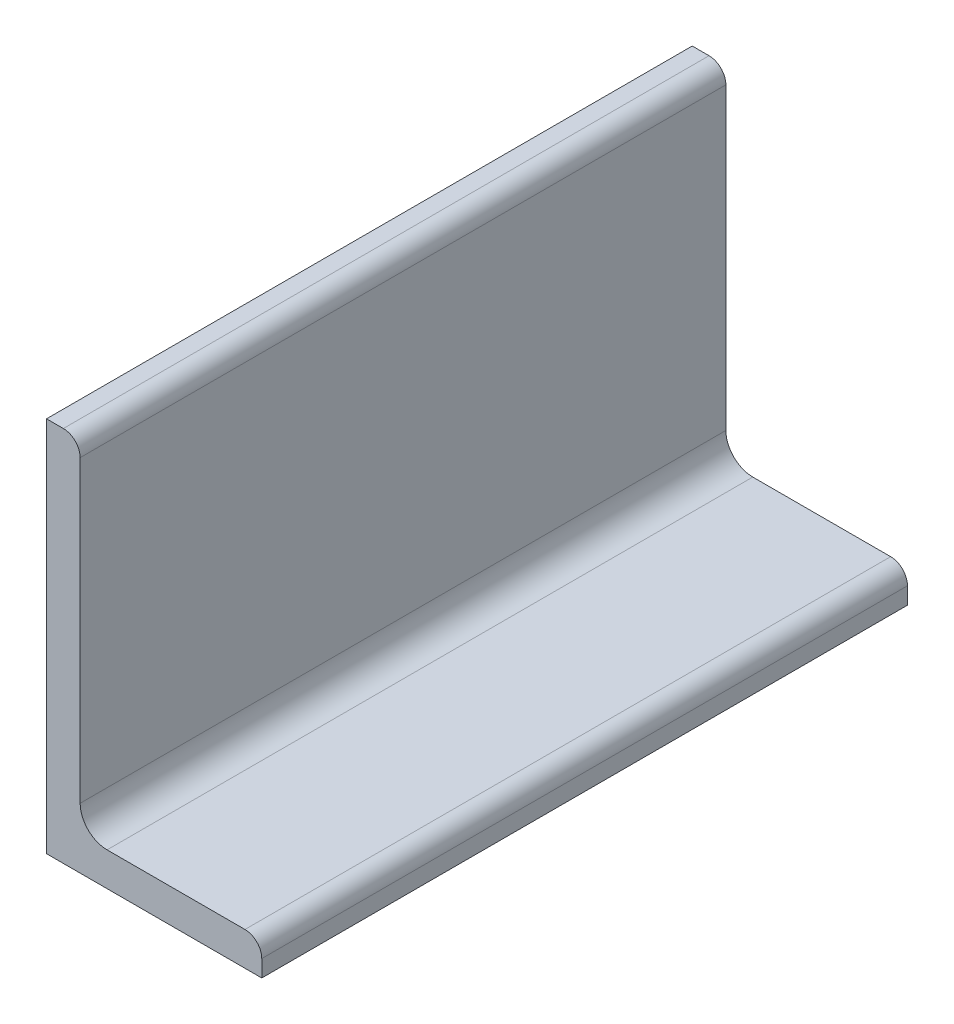
ISO-10303-21;
HEADER;
FILE_DESCRIPTION(('STEP AP214'),'2;1');
FILE_NAME('part.step','',(''),(''),'','','');
FILE_SCHEMA(('AUTOMOTIVE_DESIGN { 1 0 10303 214 1 1 1 1 }'));
ENDSEC;
DATA;
#1=APPLICATION_CONTEXT('core data for automotive mechanical design processes');
#2=APPLICATION_PROTOCOL_DEFINITION('international standard','automotive_design',2000,#1);
#3=PRODUCT_CONTEXT('',#1,'mechanical');
#4=PRODUCT('Part','Part','',(#3));
#5=PRODUCT_RELATED_PRODUCT_CATEGORY('part','',(#4));
#6=PRODUCT_DEFINITION_FORMATION('','',#4);
#7=PRODUCT_DEFINITION_CONTEXT('part definition',#1,'design');
#8=PRODUCT_DEFINITION('design','',#6,#7);
#9=PRODUCT_DEFINITION_SHAPE('','',#8);
#10=(LENGTH_UNIT() NAMED_UNIT(*) SI_UNIT(.MILLI.,.METRE.));
#11=(NAMED_UNIT(*) PLANE_ANGLE_UNIT() SI_UNIT($,.RADIAN.));
#12=(NAMED_UNIT(*) SI_UNIT($,.STERADIAN.) SOLID_ANGLE_UNIT());
#13=UNCERTAINTY_MEASURE_WITH_UNIT(LENGTH_MEASURE(1.E-05),#10,'distance_accuracy_value','');
#14=(GEOMETRIC_REPRESENTATION_CONTEXT(3) GLOBAL_UNCERTAINTY_ASSIGNED_CONTEXT((#13)) GLOBAL_UNIT_ASSIGNED_CONTEXT((#10,
#11,#12)) REPRESENTATION_CONTEXT('',''));
#15=CARTESIAN_POINT('',(0.,0.,0.));
#16=DIRECTION('',(0.,0.,1.));
#17=DIRECTION('',(1.,0.,0.));
#18=AXIS2_PLACEMENT_3D('',#15,#16,#17);
#19=CARTESIAN_POINT('',(0.865045893659089,178.809200992538,304.8));
#20=DIRECTION('',(1.,0.,0.));
#21=DIRECTION('',(0.,0.,-1.));
#22=AXIS2_PLACEMENT_3D('',#19,#20,#21);
#23=PLANE('',#22);
#24=DIRECTION('',(0.,-1.,0.));
#25=VECTOR('',#24,1.);
#26=CARTESIAN_POINT('',(0.865045893659089,178.809200992538,0.));
#27=LINE('',#26,#25);
#28=CARTESIAN_POINT('',(0.865045893659089,178.809200992538,0.));
#29=VERTEX_POINT('',#28);
#30=CARTESIAN_POINT('',(0.865045893659089,1.00920099253831,0.));
#31=VERTEX_POINT('',#30);
#32=EDGE_CURVE('E135',#29,#31,#27,.T.);
#33=ORIENTED_EDGE('',*,*,#32,.T.);
#34=DIRECTION('',(0.,0.,-1.));
#35=VECTOR('',#34,1.);
#36=CARTESIAN_POINT('',(0.865045893659089,1.00920099253831,304.8));
#37=LINE('',#36,#35);
#38=CARTESIAN_POINT('',(0.865045893659089,1.00920099253831,304.8));
#39=VERTEX_POINT('',#38);
#40=EDGE_CURVE('E11',#39,#31,#37,.T.);
#41=ORIENTED_EDGE('',*,*,#40,.F.);
#42=DIRECTION('',(0.,-1.,0.));
#43=VECTOR('',#42,1.);
#44=CARTESIAN_POINT('',(0.865045893659089,178.809200992538,304.8));
#45=LINE('',#44,#43);
#46=CARTESIAN_POINT('',(0.865045893659089,178.809200992538,304.8));
#47=VERTEX_POINT('',#46);
#48=EDGE_CURVE('E151',#47,#39,#45,.T.);
#49=ORIENTED_EDGE('',*,*,#48,.F.);
#50=DIRECTION('',(0.,0.,-1.));
#51=VECTOR('',#50,1.);
#52=CARTESIAN_POINT('',(0.865045893659089,178.809200992538,304.8));
#53=LINE('',#52,#51);
#54=EDGE_CURVE('E131',#47,#29,#53,.T.);
#55=ORIENTED_EDGE('',*,*,#54,.T.);
#56=EDGE_LOOP('',(#33,#41,#49,#55));
#57=FACE_BOUND('',#56,.T.);
#58=ADVANCED_FACE('F33',(#57),#23,.F.);
#59=CARTESIAN_POINT('',(0.865045893659089,1.00920099253831,304.8));
#60=DIRECTION('',(0.,1.,0.));
#61=DIRECTION('',(0.,0.,1.));
#62=AXIS2_PLACEMENT_3D('',#59,#60,#61);
#63=PLANE('',#62);
#64=DIRECTION('',(1.,0.,0.));
#65=VECTOR('',#64,1.);
#66=CARTESIAN_POINT('',(0.865045893659089,1.00920099253831,0.));
#67=LINE('',#66,#65);
#68=CARTESIAN_POINT('',(102.465045893659,1.00920099253831,0.));
#69=VERTEX_POINT('',#68);
#70=EDGE_CURVE('E138',#31,#69,#67,.T.);
#71=ORIENTED_EDGE('',*,*,#70,.T.);
#72=DIRECTION('',(0.,0.,-1.));
#73=VECTOR('',#72,1.);
#74=CARTESIAN_POINT('',(102.465045893659,1.00920099253831,304.8));
#75=LINE('',#74,#73);
#76=CARTESIAN_POINT('',(102.465045893659,1.00920099253831,304.8));
#77=VERTEX_POINT('',#76);
#78=EDGE_CURVE('E41',#77,#69,#75,.T.);
#79=ORIENTED_EDGE('',*,*,#78,.F.);
#80=DIRECTION('',(1.,0.,0.));
#81=VECTOR('',#80,1.);
#82=CARTESIAN_POINT('',(0.865045893659089,1.00920099253831,304.8));
#83=LINE('',#82,#81);
#84=EDGE_CURVE('E95',#39,#77,#83,.T.);
#85=ORIENTED_EDGE('',*,*,#84,.F.);
#86=ORIENTED_EDGE('',*,*,#40,.T.);
#87=EDGE_LOOP('',(#71,#79,#85,#86));
#88=FACE_BOUND('',#87,.T.);
#89=ADVANCED_FACE('F194',(#88),#63,.F.);
#90=CARTESIAN_POINT('',(102.465045893659,1.00920099253831,304.8));
#91=DIRECTION('',(-1.,0.,0.));
#92=DIRECTION('',(0.,0.,1.));
#93=AXIS2_PLACEMENT_3D('',#90,#91,#92);
#94=PLANE('',#93);
#95=DIRECTION('',(0.,1.,0.));
#96=VECTOR('',#95,1.);
#97=CARTESIAN_POINT('',(102.465045893659,1.00920099253831,0.));
#98=LINE('',#97,#96);
#99=CARTESIAN_POINT('',(102.465045893659,8.94670099253831,0.));
#100=VERTEX_POINT('',#99);
#101=EDGE_CURVE('E140',#69,#100,#98,.T.);
#102=ORIENTED_EDGE('',*,*,#101,.T.);
#103=DIRECTION('',(0.,0.,-1.));
#104=VECTOR('',#103,1.);
#105=CARTESIAN_POINT('',(102.465045893659,8.94670099253831,304.8));
#106=LINE('',#105,#104);
#107=CARTESIAN_POINT('',(102.465045893659,8.94670099253831,304.8));
#108=VERTEX_POINT('',#107);
#109=EDGE_CURVE('E161',#108,#100,#106,.T.);
#110=ORIENTED_EDGE('',*,*,#109,.F.);
#111=DIRECTION('',(0.,1.,0.));
#112=VECTOR('',#111,1.);
#113=CARTESIAN_POINT('',(102.465045893659,1.00920099253831,304.8));
#114=LINE('',#113,#112);
#115=EDGE_CURVE('E169',#77,#108,#114,.T.);
#116=ORIENTED_EDGE('',*,*,#115,.F.);
#117=ORIENTED_EDGE('',*,*,#78,.T.);
#118=EDGE_LOOP('',(#102,#110,#116,#117));
#119=FACE_BOUND('',#118,.T.);
#120=ADVANCED_FACE('F167',(#119),#94,.F.);
#121=CARTESIAN_POINT('',(94.5275458936591,8.94670099253831,304.8));
#122=DIRECTION('',(0.,0.,-1.));
#123=DIRECTION('',(-1.,0.,0.));
#124=AXIS2_PLACEMENT_3D('',#121,#122,#123);
#125=CYLINDRICAL_SURFACE('',#124,7.93750000000001);
#126=CARTESIAN_POINT('',(94.5275458936591,8.94670099253831,0.));
#127=DIRECTION('',(0.,0.,1.));
#128=DIRECTION('',(1.,0.,0.));
#129=AXIS2_PLACEMENT_3D('',#126,#127,#128);
#130=CIRCLE('',#129,7.93750000000001);
#131=CARTESIAN_POINT('',(94.5275458936591,16.8842009925383,0.));
#132=VERTEX_POINT('',#131);
#133=EDGE_CURVE('E142',#100,#132,#130,.T.);
#134=ORIENTED_EDGE('',*,*,#133,.T.);
#135=DIRECTION('',(0.,0.,-1.));
#136=VECTOR('',#135,1.);
#137=CARTESIAN_POINT('',(94.5275458936591,16.8842009925383,304.8));
#138=LINE('',#137,#136);
#139=CARTESIAN_POINT('',(94.5275458936591,16.8842009925383,304.8));
#140=VERTEX_POINT('',#139);
#141=EDGE_CURVE('E158',#140,#132,#138,.T.);
#142=ORIENTED_EDGE('',*,*,#141,.F.);
#143=CARTESIAN_POINT('',(94.5275458936591,8.94670099253831,304.8));
#144=DIRECTION('',(0.,0.,1.));
#145=DIRECTION('',(1.,0.,0.));
#146=AXIS2_PLACEMENT_3D('',#143,#144,#145);
#147=CIRCLE('',#146,7.93750000000001);
#148=EDGE_CURVE('E185',#108,#140,#147,.T.);
#149=ORIENTED_EDGE('',*,*,#148,.F.);
#150=ORIENTED_EDGE('',*,*,#109,.T.);
#151=EDGE_LOOP('',(#134,#142,#149,#150));
#152=FACE_BOUND('',#151,.T.);
#153=ADVANCED_FACE('F178',(#152),#125,.T.);
#154=CARTESIAN_POINT('',(94.5275458936591,16.8842009925383,304.8));
#155=DIRECTION('',(0.,-1.,0.));
#156=DIRECTION('',(0.,0.,-1.));
#157=AXIS2_PLACEMENT_3D('',#154,#155,#156);
#158=PLANE('',#157);
#159=DIRECTION('',(-1.,0.,0.));
#160=VECTOR('',#159,1.);
#161=CARTESIAN_POINT('',(94.5275458936591,16.8842009925383,0.));
#162=LINE('',#161,#160);
#163=CARTESIAN_POINT('',(29.4400458936591,16.8842009925383,0.));
#164=VERTEX_POINT('',#163);
#165=EDGE_CURVE('E144',#132,#164,#162,.T.);
#166=ORIENTED_EDGE('',*,*,#165,.T.);
#167=DIRECTION('',(0.,0.,-1.));
#168=VECTOR('',#167,1.);
#169=CARTESIAN_POINT('',(29.4400458936591,16.8842009925383,304.8));
#170=LINE('',#169,#168);
#171=CARTESIAN_POINT('',(29.4400458936591,16.8842009925383,304.8));
#172=VERTEX_POINT('',#171);
#173=EDGE_CURVE('E155',#172,#164,#170,.T.);
#174=ORIENTED_EDGE('',*,*,#173,.F.);
#175=DIRECTION('',(-1.,0.,0.));
#176=VECTOR('',#175,1.);
#177=CARTESIAN_POINT('',(94.5275458936591,16.8842009925383,304.8));
#178=LINE('',#177,#176);
#179=EDGE_CURVE('E184',#140,#172,#178,.T.);
#180=ORIENTED_EDGE('',*,*,#179,.F.);
#181=ORIENTED_EDGE('',*,*,#141,.T.);
#182=EDGE_LOOP('',(#166,#174,#180,#181));
#183=FACE_BOUND('',#182,.T.);
#184=ADVANCED_FACE('F182',(#183),#158,.F.);
#185=CARTESIAN_POINT('',(29.4400458936591,29.5842009925383,304.8));
#186=DIRECTION('',(0.,0.,-1.));
#187=DIRECTION('',(-1.,0.,0.));
#188=AXIS2_PLACEMENT_3D('',#185,#186,#187);
#189=CYLINDRICAL_SURFACE('',#188,12.7);
#190=CARTESIAN_POINT('',(29.4400458936591,29.5842009925383,0.));
#191=DIRECTION('',(0.,0.,-1.));
#192=DIRECTION('',(1.,0.,0.));
#193=AXIS2_PLACEMENT_3D('',#190,#191,#192);
#194=CIRCLE('',#193,12.7);
#195=CARTESIAN_POINT('',(16.7400458936591,29.5842009925383,0.));
#196=VERTEX_POINT('',#195);
#197=EDGE_CURVE('E146',#164,#196,#194,.T.);
#198=ORIENTED_EDGE('',*,*,#197,.T.);
#199=DIRECTION('',(0.,0.,-1.));
#200=VECTOR('',#199,1.);
#201=CARTESIAN_POINT('',(16.7400458936591,29.5842009925383,304.8));
#202=LINE('',#201,#200);
#203=CARTESIAN_POINT('',(16.7400458936591,29.5842009925383,304.8));
#204=VERTEX_POINT('',#203);
#205=EDGE_CURVE('E126',#204,#196,#202,.T.);
#206=ORIENTED_EDGE('',*,*,#205,.F.);
#207=CARTESIAN_POINT('',(29.4400458936591,29.5842009925383,304.8));
#208=DIRECTION('',(0.,0.,-1.));
#209=DIRECTION('',(1.,0.,0.));
#210=AXIS2_PLACEMENT_3D('',#207,#208,#209);
#211=CIRCLE('',#210,12.7);
#212=EDGE_CURVE('E117',#172,#204,#211,.T.);
#213=ORIENTED_EDGE('',*,*,#212,.F.);
#214=ORIENTED_EDGE('',*,*,#173,.T.);
#215=EDGE_LOOP('',(#198,#206,#213,#214));
#216=FACE_BOUND('',#215,.T.);
#217=ADVANCED_FACE('F206',(#216),#189,.F.);
#218=CARTESIAN_POINT('',(16.7400458936591,29.5842009925383,304.8));
#219=DIRECTION('',(-1.,0.,0.));
#220=DIRECTION('',(0.,0.,1.));
#221=AXIS2_PLACEMENT_3D('',#218,#219,#220);
#222=PLANE('',#221);
#223=DIRECTION('',(0.,1.,0.));
#224=VECTOR('',#223,1.);
#225=CARTESIAN_POINT('',(16.7400458936591,29.5842009925383,0.));
#226=LINE('',#225,#224);
#227=CARTESIAN_POINT('',(16.7400458936591,170.871700992538,0.));
#228=VERTEX_POINT('',#227);
#229=EDGE_CURVE('E125',#196,#228,#226,.T.);
#230=ORIENTED_EDGE('',*,*,#229,.T.);
#231=DIRECTION('',(0.,0.,-1.));
#232=VECTOR('',#231,1.);
#233=CARTESIAN_POINT('',(16.7400458936591,170.871700992538,304.8));
#234=LINE('',#233,#232);
#235=CARTESIAN_POINT('',(16.7400458936591,170.871700992538,304.8));
#236=VERTEX_POINT('',#235);
#237=EDGE_CURVE('E122',#236,#228,#234,.T.);
#238=ORIENTED_EDGE('',*,*,#237,.F.);
#239=DIRECTION('',(0.,1.,0.));
#240=VECTOR('',#239,1.);
#241=CARTESIAN_POINT('',(16.7400458936591,29.5842009925383,304.8));
#242=LINE('',#241,#240);
#243=EDGE_CURVE('E111',#204,#236,#242,.T.);
#244=ORIENTED_EDGE('',*,*,#243,.F.);
#245=ORIENTED_EDGE('',*,*,#205,.T.);
#246=EDGE_LOOP('',(#230,#238,#244,#245));
#247=FACE_BOUND('',#246,.T.);
#248=ADVANCED_FACE('F123',(#247),#222,.F.);
#249=CARTESIAN_POINT('',(8.80254589365908,170.871700992538,304.8));
#250=DIRECTION('',(0.,0.,-1.));
#251=DIRECTION('',(-1.,0.,0.));
#252=AXIS2_PLACEMENT_3D('',#249,#250,#251);
#253=CYLINDRICAL_SURFACE('',#252,7.93750000000001);
#254=CARTESIAN_POINT('',(8.80254589365908,170.871700992538,0.));
#255=DIRECTION('',(0.,0.,1.));
#256=DIRECTION('',(1.,0.,0.));
#257=AXIS2_PLACEMENT_3D('',#254,#255,#256);
#258=CIRCLE('',#257,7.93750000000001);
#259=CARTESIAN_POINT('',(8.80254589365909,178.809200992538,0.));
#260=VERTEX_POINT('',#259);
#261=EDGE_CURVE('E81',#228,#260,#258,.T.);
#262=ORIENTED_EDGE('',*,*,#261,.T.);
#263=DIRECTION('',(0.,0.,-1.));
#264=VECTOR('',#263,1.);
#265=CARTESIAN_POINT('',(8.80254589365909,178.809200992538,304.8));
#266=LINE('',#265,#264);
#267=CARTESIAN_POINT('',(8.80254589365909,178.809200992538,304.8));
#268=VERTEX_POINT('',#267);
#269=EDGE_CURVE('E127',#268,#260,#266,.T.);
#270=ORIENTED_EDGE('',*,*,#269,.F.);
#271=CARTESIAN_POINT('',(8.80254589365908,170.871700992538,304.8));
#272=DIRECTION('',(0.,0.,1.));
#273=DIRECTION('',(1.,0.,0.));
#274=AXIS2_PLACEMENT_3D('',#271,#272,#273);
#275=CIRCLE('',#274,7.93750000000001);
#276=EDGE_CURVE('E115',#236,#268,#275,.T.);
#277=ORIENTED_EDGE('',*,*,#276,.F.);
#278=ORIENTED_EDGE('',*,*,#237,.T.);
#279=EDGE_LOOP('',(#262,#270,#277,#278));
#280=FACE_BOUND('',#279,.T.);
#281=ADVANCED_FACE('F129',(#280),#253,.T.);
#282=CARTESIAN_POINT('',(8.80254589365909,178.809200992538,304.8));
#283=DIRECTION('',(0.,-1.,0.));
#284=DIRECTION('',(0.,0.,-1.));
#285=AXIS2_PLACEMENT_3D('',#282,#283,#284);
#286=PLANE('',#285);
#287=DIRECTION('',(-1.,0.,0.));
#288=VECTOR('',#287,1.);
#289=CARTESIAN_POINT('',(8.80254589365909,178.809200992538,0.));
#290=LINE('',#289,#288);
#291=EDGE_CURVE('E87',#260,#29,#290,.T.);
#292=ORIENTED_EDGE('',*,*,#291,.T.);
#293=ORIENTED_EDGE('',*,*,#54,.F.);
#294=DIRECTION('',(-1.,0.,0.));
#295=VECTOR('',#294,1.);
#296=CARTESIAN_POINT('',(8.80254589365909,178.809200992538,304.8));
#297=LINE('',#296,#295);
#298=EDGE_CURVE('E49',#268,#47,#297,.T.);
#299=ORIENTED_EDGE('',*,*,#298,.F.);
#300=ORIENTED_EDGE('',*,*,#269,.T.);
#301=EDGE_LOOP('',(#292,#293,#299,#300));
#302=FACE_BOUND('',#301,.T.);
#303=ADVANCED_FACE('F214',(#302),#286,.F.);
#304=CARTESIAN_POINT('',(94.5275458936591,8.94670099253831,304.8));
#305=DIRECTION('',(0.,0.,1.));
#306=DIRECTION('',(1.,0.,0.));
#307=AXIS2_PLACEMENT_3D('',#304,#305,#306);
#308=PLANE('',#307);
#309=ORIENTED_EDGE('',*,*,#48,.T.);
#310=ORIENTED_EDGE('',*,*,#84,.T.);
#311=ORIENTED_EDGE('',*,*,#115,.T.);
#312=ORIENTED_EDGE('',*,*,#148,.T.);
#313=ORIENTED_EDGE('',*,*,#179,.T.);
#314=ORIENTED_EDGE('',*,*,#212,.T.);
#315=ORIENTED_EDGE('',*,*,#243,.T.);
#316=ORIENTED_EDGE('',*,*,#276,.T.);
#317=ORIENTED_EDGE('',*,*,#298,.T.);
#318=EDGE_LOOP('',(#309,#310,#311,#312,#313,#314,#315,#316,#317));
#319=FACE_BOUND('',#318,.T.);
#320=ADVANCED_FACE('F113',(#319),#308,.T.);
#321=CARTESIAN_POINT('',(94.5275458936591,8.94670099253831,0.));
#322=DIRECTION('',(0.,0.,1.));
#323=DIRECTION('',(1.,0.,0.));
#324=AXIS2_PLACEMENT_3D('',#321,#322,#323);
#325=PLANE('',#324);
#326=ORIENTED_EDGE('',*,*,#32,.F.);
#327=ORIENTED_EDGE('',*,*,#291,.F.);
#328=ORIENTED_EDGE('',*,*,#261,.F.);
#329=ORIENTED_EDGE('',*,*,#229,.F.);
#330=ORIENTED_EDGE('',*,*,#197,.F.);
#331=ORIENTED_EDGE('',*,*,#165,.F.);
#332=ORIENTED_EDGE('',*,*,#133,.F.);
#333=ORIENTED_EDGE('',*,*,#101,.F.);
#334=ORIENTED_EDGE('',*,*,#70,.F.);
#335=EDGE_LOOP('',(#326,#327,#328,#329,#330,#331,#332,#333,#334));
#336=FACE_BOUND('',#335,.T.);
#337=ADVANCED_FACE('F173',(#336),#325,.F.);
#338=CLOSED_SHELL('',(#58,#89,#120,#153,#184,#217,#248,#281,#303,#320,#337));
#339=MANIFOLD_SOLID_BREP('B2',#338);
#340=ADVANCED_BREP_SHAPE_REPRESENTATION('',(#18,#339),#14);
#341=SHAPE_DEFINITION_REPRESENTATION(#9,#340);
ENDSEC;
END-ISO-10303-21;
